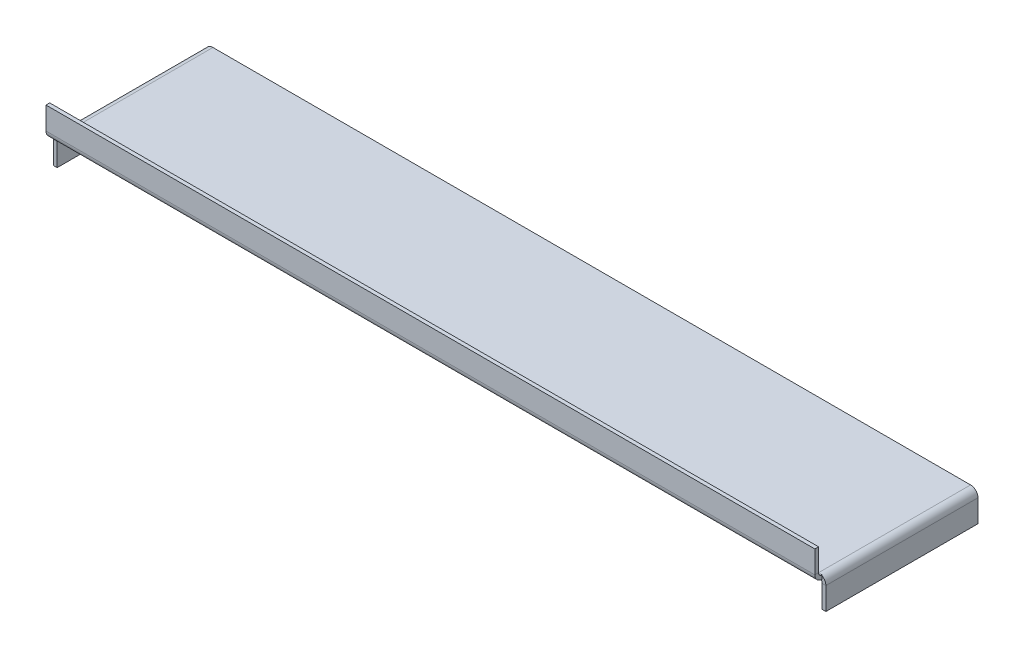
ISO-10303-21;
HEADER;
FILE_DESCRIPTION(('STEP AP214'),'2;1');
FILE_NAME('part.step','',(''),(''),'','','');
FILE_SCHEMA(('AUTOMOTIVE_DESIGN { 1 0 10303 214 1 1 1 1 }'));
ENDSEC;
DATA;
#1=APPLICATION_CONTEXT('core data for automotive mechanical design processes');
#2=APPLICATION_PROTOCOL_DEFINITION('international standard','automotive_design',2000,#1);
#3=PRODUCT_CONTEXT('',#1,'mechanical');
#4=PRODUCT('Part','Part','',(#3));
#5=PRODUCT_RELATED_PRODUCT_CATEGORY('part','',(#4));
#6=PRODUCT_DEFINITION_FORMATION('','',#4);
#7=PRODUCT_DEFINITION_CONTEXT('part definition',#1,'design');
#8=PRODUCT_DEFINITION('design','',#6,#7);
#9=PRODUCT_DEFINITION_SHAPE('','',#8);
#10=(LENGTH_UNIT() NAMED_UNIT(*) SI_UNIT(.MILLI.,.METRE.));
#11=(NAMED_UNIT(*) PLANE_ANGLE_UNIT() SI_UNIT($,.RADIAN.));
#12=(NAMED_UNIT(*) SI_UNIT($,.STERADIAN.) SOLID_ANGLE_UNIT());
#13=UNCERTAINTY_MEASURE_WITH_UNIT(LENGTH_MEASURE(1.E-05),#10,'distance_accuracy_value','');
#14=(GEOMETRIC_REPRESENTATION_CONTEXT(3) GLOBAL_UNCERTAINTY_ASSIGNED_CONTEXT((#13)) GLOBAL_UNIT_ASSIGNED_CONTEXT((#10,
#11,#12)) REPRESENTATION_CONTEXT('',''));
#15=CARTESIAN_POINT('',(0.,0.,0.));
#16=DIRECTION('',(0.,0.,1.));
#17=DIRECTION('',(1.,0.,0.));
#18=AXIS2_PLACEMENT_3D('',#15,#16,#17);
#19=CARTESIAN_POINT('',(244.844000024,-2.3622,46.0777999999999));
#20=DIRECTION('',(0.,0.,-1.));
#21=DIRECTION('',(-1.,0.,0.));
#22=AXIS2_PLACEMENT_3D('',#19,#20,#21);
#23=PLANE('',#22);
#24=DIRECTION('',(0.,-1.,0.));
#25=VECTOR('',#24,1.);
#26=CARTESIAN_POINT('',(244.844000024,0.,46.0778));
#27=LINE('',#26,#25);
#28=CARTESIAN_POINT('',(244.844000024,0.,46.0777999999999));
#29=VERTEX_POINT('',#28);
#30=CARTESIAN_POINT('',(244.844000024,-0.632019950173396,46.0778));
#31=VERTEX_POINT('',#30);
#32=EDGE_CURVE('E388',#29,#31,#27,.T.);
#33=ORIENTED_EDGE('',*,*,#32,.T.);
#34=CARTESIAN_POINT('',(242.484000024,-4.72220000000002,46.0777999999999));
#35=DIRECTION('',(0.,0.,1.));
#36=DIRECTION('',(1.,0.,0.));
#37=AXIS2_PLACEMENT_3D('',#34,#35,#36);
#38=CIRCLE('',#37,4.72219999999997);
#39=CARTESIAN_POINT('',(242.484000024,0.,46.0778));
#40=VERTEX_POINT('',#39);
#41=EDGE_CURVE('E13',#31,#40,#38,.T.);
#42=ORIENTED_EDGE('',*,*,#41,.T.);
#43=DIRECTION('',(1.,0.,0.));
#44=VECTOR('',#43,1.);
#45=CARTESIAN_POINT('',(244.844000024,0.,46.0778));
#46=LINE('',#45,#44);
#47=EDGE_CURVE('E378',#29,#40,#46,.F.);
#48=ORIENTED_EDGE('',*,*,#47,.F.);
#49=EDGE_LOOP('',(#33,#42,#48));
#50=FACE_BOUND('',#49,.T.);
#51=ADVANCED_FACE('F83',(#50),#23,.T.);
#52=CARTESIAN_POINT('',(0.,-2.3622,0.));
#53=DIRECTION('',(0.,1.,0.));
#54=DIRECTION('',(0.,0.,1.));
#55=AXIS2_PLACEMENT_3D('',#52,#53,#54);
#56=PLANE('',#55);
#57=DIRECTION('',(0.,0.,1.));
#58=VECTOR('',#57,1.);
#59=CARTESIAN_POINT('',(242.484000024,-2.36220000000005,46.0777999999999));
#60=LINE('',#59,#58);
#61=CARTESIAN_POINT('',(242.484000024,-2.36220000000005,46.0777999999999));
#62=VERTEX_POINT('',#61);
#63=CARTESIAN_POINT('',(242.484000024,-2.36220000000005,-50.8));
#64=VERTEX_POINT('',#63);
#65=EDGE_CURVE('E273',#62,#64,#60,.F.);
#66=ORIENTED_EDGE('',*,*,#65,.F.);
#67=DIRECTION('',(1.,0.,0.));
#68=VECTOR('',#67,1.);
#69=CARTESIAN_POINT('',(244.844000024,-2.3622,46.0777999999999));
#70=LINE('',#69,#68);
#71=CARTESIAN_POINT('',(-240.121800024,-2.36219999999999,46.0778));
#72=VERTEX_POINT('',#71);
#73=EDGE_CURVE('E370',#62,#72,#70,.F.);
#74=ORIENTED_EDGE('',*,*,#73,.T.);
#75=DIRECTION('',(0.,0.,-1.));
#76=VECTOR('',#75,1.);
#77=CARTESIAN_POINT('',(-240.121800024,-2.36219999999999,-50.8));
#78=LINE('',#77,#76);
#79=CARTESIAN_POINT('',(-240.121800024,-2.36219999999999,-50.8));
#80=VERTEX_POINT('',#79);
#81=EDGE_CURVE('E325',#80,#72,#78,.F.);
#82=ORIENTED_EDGE('',*,*,#81,.F.);
#83=DIRECTION('',(-1.,0.,0.));
#84=VECTOR('',#83,1.);
#85=CARTESIAN_POINT('',(244.844000024,-2.3622,-50.8));
#86=LINE('',#85,#84);
#87=EDGE_CURVE('E92',#64,#80,#86,.T.);
#88=ORIENTED_EDGE('',*,*,#87,.F.);
#89=EDGE_LOOP('',(#66,#74,#82,#88));
#90=FACE_BOUND('',#89,.T.);
#91=ADVANCED_FACE('F441',(#90),#56,.F.);
#92=CARTESIAN_POINT('',(0.,0.,0.));
#93=DIRECTION('',(0.,1.,0.));
#94=DIRECTION('',(0.,0.,1.));
#95=AXIS2_PLACEMENT_3D('',#92,#93,#94);
#96=PLANE('',#95);
#97=CARTESIAN_POINT('',(-240.121800024,0.,46.0778));
#98=VERTEX_POINT('',#97);
#99=EDGE_CURVE('E381',#40,#98,#46,.F.);
#100=ORIENTED_EDGE('',*,*,#99,.F.);
#101=DIRECTION('',(0.,0.,1.));
#102=VECTOR('',#101,1.);
#103=CARTESIAN_POINT('',(242.484000024,0.,46.0777999999999));
#104=LINE('',#103,#102);
#105=CARTESIAN_POINT('',(242.484000024,0.,-50.8));
#106=VERTEX_POINT('',#105);
#107=EDGE_CURVE('E224',#40,#106,#104,.F.);
#108=ORIENTED_EDGE('',*,*,#107,.T.);
#109=DIRECTION('',(-1.,0.,0.));
#110=VECTOR('',#109,1.);
#111=CARTESIAN_POINT('',(244.844000024,0.,-50.8));
#112=LINE('',#111,#110);
#113=CARTESIAN_POINT('',(-240.121800024,0.,-50.8));
#114=VERTEX_POINT('',#113);
#115=EDGE_CURVE('E87',#106,#114,#112,.T.);
#116=ORIENTED_EDGE('',*,*,#115,.T.);
#117=DIRECTION('',(0.,0.,-1.));
#118=VECTOR('',#117,1.);
#119=CARTESIAN_POINT('',(-240.121800024,0.,-50.8));
#120=LINE('',#119,#118);
#121=EDGE_CURVE('E311',#114,#98,#120,.F.);
#122=ORIENTED_EDGE('',*,*,#121,.T.);
#123=EDGE_LOOP('',(#100,#108,#116,#122));
#124=FACE_BOUND('',#123,.T.);
#125=ADVANCED_FACE('F394',(#124),#96,.T.);
#126=CARTESIAN_POINT('',(-240.121800024,-2.36219999999999,46.0778));
#127=DIRECTION('',(0.,0.,-1.));
#128=DIRECTION('',(0.,1.,0.));
#129=AXIS2_PLACEMENT_3D('',#126,#127,#128);
#130=PLANE('',#129);
#131=CARTESIAN_POINT('',(-244.844000024,0.,46.0778));
#132=VERTEX_POINT('',#131);
#133=EDGE_CURVE('E382',#98,#132,#46,.F.);
#134=ORIENTED_EDGE('',*,*,#133,.F.);
#135=CARTESIAN_POINT('',(-240.121800024,-4.72220000000002,46.0778));
#136=DIRECTION('',(0.,0.,-1.));
#137=DIRECTION('',(-1.,0.,0.));
#138=AXIS2_PLACEMENT_3D('',#135,#136,#137);
#139=CIRCLE('',#138,4.72220000000003);
#140=CARTESIAN_POINT('',(-244.211980073827,-2.3622,46.0778));
#141=VERTEX_POINT('',#140);
#142=EDGE_CURVE('E316',#98,#141,#139,.F.);
#143=ORIENTED_EDGE('',*,*,#142,.T.);
#144=DIRECTION('',(-1.,0.,0.));
#145=VECTOR('',#144,1.);
#146=CARTESIAN_POINT('',(-240.121800024,-2.36219999999999,46.0778));
#147=LINE('',#146,#145);
#148=CARTESIAN_POINT('',(-244.844000024,-2.3622,46.0778));
#149=VERTEX_POINT('',#148);
#150=EDGE_CURVE('E332',#141,#149,#147,.T.);
#151=ORIENTED_EDGE('',*,*,#150,.T.);
#152=DIRECTION('',(0.,-1.,0.));
#153=VECTOR('',#152,1.);
#154=CARTESIAN_POINT('',(-244.844000024,0.,46.0778));
#155=LINE('',#154,#153);
#156=EDGE_CURVE('E385',#132,#149,#155,.T.);
#157=ORIENTED_EDGE('',*,*,#156,.F.);
#158=EDGE_LOOP('',(#134,#143,#151,#157));
#159=FACE_BOUND('',#158,.T.);
#160=ADVANCED_FACE('F561',(#159),#130,.T.);
#161=CARTESIAN_POINT('',(244.844000024,-2.3622,-50.8));
#162=DIRECTION('',(0.,0.,-1.));
#163=DIRECTION('',(-1.,0.,0.));
#164=AXIS2_PLACEMENT_3D('',#161,#162,#163);
#165=PLANE('',#164);
#166=DIRECTION('',(0.,1.,0.));
#167=VECTOR('',#166,1.);
#168=CARTESIAN_POINT('',(242.484000024,-2.36220000000005,-50.8));
#169=LINE('',#168,#167);
#170=EDGE_CURVE('E269',#64,#106,#169,.T.);
#171=ORIENTED_EDGE('',*,*,#170,.F.);
#172=ORIENTED_EDGE('',*,*,#87,.T.);
#173=DIRECTION('',(0.,1.,0.));
#174=VECTOR('',#173,1.);
#175=CARTESIAN_POINT('',(-240.121800024,-2.36219999999999,-50.8));
#176=LINE('',#175,#174);
#177=EDGE_CURVE('E319',#80,#114,#176,.T.);
#178=ORIENTED_EDGE('',*,*,#177,.T.);
#179=ORIENTED_EDGE('',*,*,#115,.F.);
#180=EDGE_LOOP('',(#171,#172,#178,#179));
#181=FACE_BOUND('',#180,.T.);
#182=ADVANCED_FACE('F85',(#181),#165,.T.);
#183=CARTESIAN_POINT('',(-244.844000024,2.36,46.0778));
#184=DIRECTION('',(-1.,0.,0.));
#185=DIRECTION('',(0.,0.,1.));
#186=AXIS2_PLACEMENT_3D('',#183,#184,#185);
#187=PLANE('',#186);
#188=DIRECTION('',(0.,0.,-1.));
#189=VECTOR('',#188,1.);
#190=CARTESIAN_POINT('',(-244.844000024,2.35999999999999,50.8));
#191=LINE('',#190,#189);
#192=CARTESIAN_POINT('',(-244.844000024,2.36,48.4378));
#193=VERTEX_POINT('',#192);
#194=CARTESIAN_POINT('',(-244.844000024,2.36,50.8));
#195=VERTEX_POINT('',#194);
#196=EDGE_CURVE('E336',#193,#195,#191,.F.);
#197=ORIENTED_EDGE('',*,*,#196,.F.);
#198=CARTESIAN_POINT('',(-244.844000024,2.36,46.0778));
#199=DIRECTION('',(1.,0.,0.));
#200=DIRECTION('',(0.,0.,-1.));
#201=AXIS2_PLACEMENT_3D('',#198,#199,#200);
#202=CIRCLE('',#201,2.36);
#203=EDGE_CURVE('E375',#132,#193,#202,.F.);
#204=ORIENTED_EDGE('',*,*,#203,.F.);
#205=ORIENTED_EDGE('',*,*,#156,.T.);
#206=CARTESIAN_POINT('',(-244.844000024,2.36,46.0778));
#207=DIRECTION('',(1.,0.,0.));
#208=DIRECTION('',(0.,0.,-1.));
#209=AXIS2_PLACEMENT_3D('',#206,#207,#208);
#210=CIRCLE('',#209,4.7222);
#211=EDGE_CURVE('E369',#149,#195,#210,.F.);
#212=ORIENTED_EDGE('',*,*,#211,.T.);
#213=EDGE_LOOP('',(#197,#204,#205,#212));
#214=FACE_BOUND('',#213,.T.);
#215=ADVANCED_FACE('F654',(#214),#187,.T.);
#216=CARTESIAN_POINT('',(244.844000024,2.36,46.0778));
#217=DIRECTION('',(-1.,0.,0.));
#218=DIRECTION('',(0.,0.,1.));
#219=AXIS2_PLACEMENT_3D('',#216,#217,#218);
#220=PLANE('',#219);
#221=CARTESIAN_POINT('',(244.844000024,2.36,46.0778));
#222=DIRECTION('',(1.,0.,0.));
#223=DIRECTION('',(0.,0.,-1.));
#224=AXIS2_PLACEMENT_3D('',#221,#222,#223);
#225=CIRCLE('',#224,2.36);
#226=CARTESIAN_POINT('',(244.844000024,2.36,48.4378));
#227=VERTEX_POINT('',#226);
#228=EDGE_CURVE('E340',#227,#29,#225,.T.);
#229=ORIENTED_EDGE('',*,*,#228,.F.);
#230=DIRECTION('',(0.,0.,-1.));
#231=VECTOR('',#230,1.);
#232=CARTESIAN_POINT('',(244.844000024,2.36000000000001,48.4378));
#233=LINE('',#232,#231);
#234=CARTESIAN_POINT('',(244.844000024,2.36000000000001,50.8));
#235=VERTEX_POINT('',#234);
#236=EDGE_CURVE('E360',#227,#235,#233,.F.);
#237=ORIENTED_EDGE('',*,*,#236,.T.);
#238=CARTESIAN_POINT('',(244.844000024,2.36,46.0778));
#239=DIRECTION('',(1.,0.,0.));
#240=DIRECTION('',(0.,0.,-1.));
#241=AXIS2_PLACEMENT_3D('',#238,#239,#240);
#242=CIRCLE('',#241,4.7222);
#243=CARTESIAN_POINT('',(244.844000024,-2.3622,46.0777999999999));
#244=VERTEX_POINT('',#243);
#245=EDGE_CURVE('E373',#235,#244,#242,.T.);
#246=ORIENTED_EDGE('',*,*,#245,.T.);
#247=EDGE_CURVE('E101',#31,#244,#27,.T.);
#248=ORIENTED_EDGE('',*,*,#247,.F.);
#249=ORIENTED_EDGE('',*,*,#32,.F.);
#250=EDGE_LOOP('',(#229,#237,#246,#248,#249));
#251=FACE_BOUND('',#250,.T.);
#252=ADVANCED_FACE('F729',(#251),#220,.F.);
#253=CARTESIAN_POINT('',(244.844000024,2.36,46.0778));
#254=DIRECTION('',(1.,0.,0.));
#255=DIRECTION('',(0.,0.,1.));
#256=AXIS2_PLACEMENT_3D('',#253,#254,#255);
#257=CYLINDRICAL_SURFACE('',#256,4.7222);
#258=EDGE_CURVE('E367',#244,#62,#70,.F.);
#259=ORIENTED_EDGE('',*,*,#258,.F.);
#260=ORIENTED_EDGE('',*,*,#245,.F.);
#261=DIRECTION('',(1.,0.,0.));
#262=VECTOR('',#261,1.);
#263=CARTESIAN_POINT('',(-244.844000024,2.35999999999999,50.8));
#264=LINE('',#263,#262);
#265=EDGE_CURVE('E358',#235,#195,#264,.F.);
#266=ORIENTED_EDGE('',*,*,#265,.T.);
#267=ORIENTED_EDGE('',*,*,#211,.F.);
#268=ORIENTED_EDGE('',*,*,#150,.F.);
#269=EDGE_CURVE('E333',#72,#141,#147,.T.);
#270=ORIENTED_EDGE('',*,*,#269,.F.);
#271=ORIENTED_EDGE('',*,*,#73,.F.);
#272=EDGE_LOOP('',(#259,#260,#266,#267,#268,#270,#271));
#273=FACE_BOUND('',#272,.T.);
#274=ADVANCED_FACE('F718',(#273),#257,.T.);
#275=CARTESIAN_POINT('',(244.844000024,2.36,46.0778));
#276=DIRECTION('',(1.,0.,0.));
#277=DIRECTION('',(0.,0.,1.));
#278=AXIS2_PLACEMENT_3D('',#275,#276,#277);
#279=CYLINDRICAL_SURFACE('',#278,2.36);
#280=ORIENTED_EDGE('',*,*,#47,.T.);
#281=ORIENTED_EDGE('',*,*,#99,.T.);
#282=ORIENTED_EDGE('',*,*,#133,.T.);
#283=ORIENTED_EDGE('',*,*,#203,.T.);
#284=DIRECTION('',(1.,0.,0.));
#285=VECTOR('',#284,1.);
#286=CARTESIAN_POINT('',(-244.844000024,2.35999999999999,48.4378));
#287=LINE('',#286,#285);
#288=EDGE_CURVE('E363',#193,#227,#287,.T.);
#289=ORIENTED_EDGE('',*,*,#288,.T.);
#290=ORIENTED_EDGE('',*,*,#228,.T.);
#291=EDGE_LOOP('',(#280,#281,#282,#283,#289,#290));
#292=FACE_BOUND('',#291,.T.);
#293=ADVANCED_FACE('F707',(#292),#279,.F.);
#294=CARTESIAN_POINT('',(244.844000024,16.6878,50.8));
#295=DIRECTION('',(-1.,0.,0.));
#296=DIRECTION('',(0.,-1.,0.));
#297=AXIS2_PLACEMENT_3D('',#294,#295,#296);
#298=PLANE('',#297);
#299=ORIENTED_EDGE('',*,*,#236,.F.);
#300=DIRECTION('',(0.,-1.,0.));
#301=VECTOR('',#300,1.);
#302=CARTESIAN_POINT('',(244.844000024,16.6878,48.4378));
#303=LINE('',#302,#301);
#304=CARTESIAN_POINT('',(244.844000024,16.6878,48.4378));
#305=VERTEX_POINT('',#304);
#306=EDGE_CURVE('E356',#227,#305,#303,.F.);
#307=ORIENTED_EDGE('',*,*,#306,.T.);
#308=DIRECTION('',(0.,0.,-1.));
#309=VECTOR('',#308,1.);
#310=CARTESIAN_POINT('',(244.844000024,16.6878,50.8));
#311=LINE('',#310,#309);
#312=CARTESIAN_POINT('',(244.844000024,16.6878,50.8));
#313=VERTEX_POINT('',#312);
#314=EDGE_CURVE('E337',#313,#305,#311,.T.);
#315=ORIENTED_EDGE('',*,*,#314,.F.);
#316=DIRECTION('',(0.,1.,0.));
#317=VECTOR('',#316,1.);
#318=CARTESIAN_POINT('',(244.844000024,-4.07230800746604E-13,50.8));
#319=LINE('',#318,#317);
#320=EDGE_CURVE('E349',#235,#313,#319,.T.);
#321=ORIENTED_EDGE('',*,*,#320,.F.);
#322=EDGE_LOOP('',(#299,#307,#315,#321));
#323=FACE_BOUND('',#322,.T.);
#324=ADVANCED_FACE('F696',(#323),#298,.F.);
#325=CARTESIAN_POINT('',(-244.844000024,0.,50.8));
#326=DIRECTION('',(1.,0.,0.));
#327=DIRECTION('',(0.,1.,0.));
#328=AXIS2_PLACEMENT_3D('',#325,#326,#327);
#329=PLANE('',#328);
#330=ORIENTED_EDGE('',*,*,#196,.T.);
#331=DIRECTION('',(0.,-1.,0.));
#332=VECTOR('',#331,1.);
#333=CARTESIAN_POINT('',(-244.844000024,4.07230800746604E-13,50.8));
#334=LINE('',#333,#332);
#335=CARTESIAN_POINT('',(-244.844000024,16.6878,50.8));
#336=VERTEX_POINT('',#335);
#337=EDGE_CURVE('E344',#336,#195,#334,.T.);
#338=ORIENTED_EDGE('',*,*,#337,.F.);
#339=DIRECTION('',(0.,0.,-1.));
#340=VECTOR('',#339,1.);
#341=CARTESIAN_POINT('',(-244.844000024,16.6878,50.8));
#342=LINE('',#341,#340);
#343=CARTESIAN_POINT('',(-244.844000024,16.6878,48.4378));
#344=VERTEX_POINT('',#343);
#345=EDGE_CURVE('E341',#336,#344,#342,.T.);
#346=ORIENTED_EDGE('',*,*,#345,.T.);
#347=DIRECTION('',(0.,1.,0.));
#348=VECTOR('',#347,1.);
#349=CARTESIAN_POINT('',(-244.844000024,0.,48.4378));
#350=LINE('',#349,#348);
#351=EDGE_CURVE('E351',#344,#193,#350,.F.);
#352=ORIENTED_EDGE('',*,*,#351,.T.);
#353=EDGE_LOOP('',(#330,#338,#346,#352));
#354=FACE_BOUND('',#353,.T.);
#355=ADVANCED_FACE('F685',(#354),#329,.F.);
#356=CARTESIAN_POINT('',(0.,0.,50.8));
#357=DIRECTION('',(0.,0.,-1.));
#358=DIRECTION('',(-1.,0.,0.));
#359=AXIS2_PLACEMENT_3D('',#356,#357,#358);
#360=PLANE('',#359);
#361=ORIENTED_EDGE('',*,*,#265,.F.);
#362=ORIENTED_EDGE('',*,*,#320,.T.);
#363=DIRECTION('',(-1.,0.,0.));
#364=VECTOR('',#363,1.);
#365=CARTESIAN_POINT('',(0.,16.6878,50.8));
#366=LINE('',#365,#364);
#367=EDGE_CURVE('E347',#313,#336,#366,.T.);
#368=ORIENTED_EDGE('',*,*,#367,.T.);
#369=ORIENTED_EDGE('',*,*,#337,.T.);
#370=EDGE_LOOP('',(#361,#362,#368,#369));
#371=FACE_BOUND('',#370,.T.);
#372=ADVANCED_FACE('F674',(#371),#360,.F.);
#373=CARTESIAN_POINT('',(0.,0.,48.4378));
#374=DIRECTION('',(0.,0.,-1.));
#375=DIRECTION('',(-1.,0.,0.));
#376=AXIS2_PLACEMENT_3D('',#373,#374,#375);
#377=PLANE('',#376);
#378=ORIENTED_EDGE('',*,*,#306,.F.);
#379=ORIENTED_EDGE('',*,*,#288,.F.);
#380=ORIENTED_EDGE('',*,*,#351,.F.);
#381=DIRECTION('',(1.,0.,0.));
#382=VECTOR('',#381,1.);
#383=CARTESIAN_POINT('',(-244.844000024,16.6878,48.4378));
#384=LINE('',#383,#382);
#385=EDGE_CURVE('E354',#305,#344,#384,.F.);
#386=ORIENTED_EDGE('',*,*,#385,.F.);
#387=EDGE_LOOP('',(#378,#379,#380,#386));
#388=FACE_BOUND('',#387,.T.);
#389=ADVANCED_FACE('F663',(#388),#377,.T.);
#390=CARTESIAN_POINT('',(-244.844000024,16.6878,50.8));
#391=DIRECTION('',(0.,-1.,0.));
#392=DIRECTION('',(0.,0.,-1.));
#393=AXIS2_PLACEMENT_3D('',#390,#391,#392);
#394=PLANE('',#393);
#395=ORIENTED_EDGE('',*,*,#385,.T.);
#396=ORIENTED_EDGE('',*,*,#345,.F.);
#397=ORIENTED_EDGE('',*,*,#367,.F.);
#398=ORIENTED_EDGE('',*,*,#314,.T.);
#399=EDGE_LOOP('',(#395,#396,#397,#398));
#400=FACE_BOUND('',#399,.T.);
#401=ADVANCED_FACE('F634',(#400),#394,.F.);
#402=CARTESIAN_POINT('',(-240.121800024,-4.72220000000002,46.0778));
#403=DIRECTION('',(0.,0.,1.));
#404=DIRECTION('',(1.,0.,0.));
#405=AXIS2_PLACEMENT_3D('',#402,#403,#404);
#406=PLANE('',#405);
#407=CARTESIAN_POINT('',(-240.121800024,-4.72220000000002,46.0778));
#408=DIRECTION('',(0.,0.,-1.));
#409=DIRECTION('',(-1.,0.,0.));
#410=AXIS2_PLACEMENT_3D('',#407,#408,#409);
#411=CIRCLE('',#410,2.36000000000003);
#412=CARTESIAN_POINT('',(-242.481800024,-4.72220000000001,46.0778));
#413=VERTEX_POINT('',#412);
#414=EDGE_CURVE('E322',#72,#413,#411,.F.);
#415=ORIENTED_EDGE('',*,*,#414,.F.);
#416=ORIENTED_EDGE('',*,*,#269,.T.);
#417=CARTESIAN_POINT('',(-244.844000024,-4.7222,46.0778));
#418=VERTEX_POINT('',#417);
#419=EDGE_CURVE('E314',#141,#418,#139,.F.);
#420=ORIENTED_EDGE('',*,*,#419,.T.);
#421=DIRECTION('',(1.,0.,0.));
#422=VECTOR('',#421,1.);
#423=CARTESIAN_POINT('',(-244.844000024,-4.7222,46.0778));
#424=LINE('',#423,#422);
#425=EDGE_CURVE('E279',#413,#418,#424,.F.);
#426=ORIENTED_EDGE('',*,*,#425,.F.);
#427=EDGE_LOOP('',(#415,#416,#420,#426));
#428=FACE_BOUND('',#427,.T.);
#429=ADVANCED_FACE('F424',(#428),#406,.T.);
#430=CARTESIAN_POINT('',(-240.121800024,-4.72220000000002,-50.8));
#431=DIRECTION('',(0.,0.,1.));
#432=DIRECTION('',(1.,0.,0.));
#433=AXIS2_PLACEMENT_3D('',#430,#431,#432);
#434=PLANE('',#433);
#435=CARTESIAN_POINT('',(-240.121800024,-4.72220000000002,-50.8));
#436=DIRECTION('',(0.,0.,-1.));
#437=DIRECTION('',(-1.,0.,0.));
#438=AXIS2_PLACEMENT_3D('',#435,#436,#437);
#439=CIRCLE('',#438,2.36000000000003);
#440=CARTESIAN_POINT('',(-242.481800024,-4.72220000000001,-50.8));
#441=VERTEX_POINT('',#440);
#442=EDGE_CURVE('E283',#441,#80,#439,.T.);
#443=ORIENTED_EDGE('',*,*,#442,.F.);
#444=DIRECTION('',(1.,0.,0.));
#445=VECTOR('',#444,1.);
#446=CARTESIAN_POINT('',(-242.481800024,-4.72220000000001,-50.8));
#447=LINE('',#446,#445);
#448=CARTESIAN_POINT('',(-244.844000024,-4.7222,-50.8));
#449=VERTEX_POINT('',#448);
#450=EDGE_CURVE('E304',#441,#449,#447,.F.);
#451=ORIENTED_EDGE('',*,*,#450,.T.);
#452=CARTESIAN_POINT('',(-240.121800024,-4.72220000000002,-50.8));
#453=DIRECTION('',(0.,0.,-1.));
#454=DIRECTION('',(-1.,0.,0.));
#455=AXIS2_PLACEMENT_3D('',#452,#453,#454);
#456=CIRCLE('',#455,4.72220000000003);
#457=EDGE_CURVE('E315',#449,#114,#456,.T.);
#458=ORIENTED_EDGE('',*,*,#457,.T.);
#459=ORIENTED_EDGE('',*,*,#177,.F.);
#460=EDGE_LOOP('',(#443,#451,#458,#459));
#461=FACE_BOUND('',#460,.T.);
#462=ADVANCED_FACE('F403',(#461),#434,.F.);
#463=CARTESIAN_POINT('',(-240.121800024,-4.72220000000002,-50.8));
#464=DIRECTION('',(0.,0.,-1.));
#465=DIRECTION('',(-1.,0.,0.));
#466=AXIS2_PLACEMENT_3D('',#463,#464,#465);
#467=CYLINDRICAL_SURFACE('',#466,4.72220000000003);
#468=ORIENTED_EDGE('',*,*,#121,.F.);
#469=ORIENTED_EDGE('',*,*,#457,.F.);
#470=DIRECTION('',(0.,0.,-1.));
#471=VECTOR('',#470,1.);
#472=CARTESIAN_POINT('',(-244.844000024,-4.7222,46.0778));
#473=LINE('',#472,#471);
#474=EDGE_CURVE('E301',#449,#418,#473,.F.);
#475=ORIENTED_EDGE('',*,*,#474,.T.);
#476=ORIENTED_EDGE('',*,*,#419,.F.);
#477=ORIENTED_EDGE('',*,*,#142,.F.);
#478=EDGE_LOOP('',(#468,#469,#475,#476,#477));
#479=FACE_BOUND('',#478,.T.);
#480=ADVANCED_FACE('F401',(#479),#467,.T.);
#481=CARTESIAN_POINT('',(-240.121800024,-4.72220000000002,-50.8));
#482=DIRECTION('',(0.,0.,-1.));
#483=DIRECTION('',(-1.,0.,0.));
#484=AXIS2_PLACEMENT_3D('',#481,#482,#483);
#485=CYLINDRICAL_SURFACE('',#484,2.36000000000003);
#486=ORIENTED_EDGE('',*,*,#81,.T.);
#487=ORIENTED_EDGE('',*,*,#414,.T.);
#488=DIRECTION('',(0.,0.,-1.));
#489=VECTOR('',#488,1.);
#490=CARTESIAN_POINT('',(-242.481800024,-4.72220000000001,46.0778));
#491=LINE('',#490,#489);
#492=EDGE_CURVE('E307',#413,#441,#491,.T.);
#493=ORIENTED_EDGE('',*,*,#492,.T.);
#494=ORIENTED_EDGE('',*,*,#442,.T.);
#495=EDGE_LOOP('',(#486,#487,#493,#494));
#496=FACE_BOUND('',#495,.T.);
#497=ADVANCED_FACE('F427',(#496),#485,.F.);
#498=CARTESIAN_POINT('',(-244.844000024,-19.05,-50.8));
#499=DIRECTION('',(0.,0.,1.));
#500=DIRECTION('',(0.,-1.,0.));
#501=AXIS2_PLACEMENT_3D('',#498,#499,#500);
#502=PLANE('',#501);
#503=ORIENTED_EDGE('',*,*,#450,.F.);
#504=DIRECTION('',(0.,1.,0.));
#505=VECTOR('',#504,1.);
#506=CARTESIAN_POINT('',(-242.481800024,-19.05,-50.8));
#507=LINE('',#506,#505);
#508=CARTESIAN_POINT('',(-242.481800024,-19.05,-50.8));
#509=VERTEX_POINT('',#508);
#510=EDGE_CURVE('E299',#441,#509,#507,.F.);
#511=ORIENTED_EDGE('',*,*,#510,.T.);
#512=DIRECTION('',(1.,0.,0.));
#513=VECTOR('',#512,1.);
#514=CARTESIAN_POINT('',(-244.844000024,-19.05,-50.8));
#515=LINE('',#514,#513);
#516=CARTESIAN_POINT('',(-244.844000024,-19.05,-50.8));
#517=VERTEX_POINT('',#516);
#518=EDGE_CURVE('E280',#517,#509,#515,.T.);
#519=ORIENTED_EDGE('',*,*,#518,.F.);
#520=DIRECTION('',(0.,-1.,0.));
#521=VECTOR('',#520,1.);
#522=CARTESIAN_POINT('',(-244.844000024,1.2510629441583E-12,-50.8));
#523=LINE('',#522,#521);
#524=EDGE_CURVE('E292',#449,#517,#523,.T.);
#525=ORIENTED_EDGE('',*,*,#524,.F.);
#526=EDGE_LOOP('',(#503,#511,#519,#525));
#527=FACE_BOUND('',#526,.T.);
#528=ADVANCED_FACE('F414',(#527),#502,.F.);
#529=CARTESIAN_POINT('',(-244.844000024,-2.36219999999999,46.0778));
#530=DIRECTION('',(0.,0.,-1.));
#531=DIRECTION('',(-1.,0.,0.));
#532=AXIS2_PLACEMENT_3D('',#529,#530,#531);
#533=PLANE('',#532);
#534=ORIENTED_EDGE('',*,*,#425,.T.);
#535=DIRECTION('',(0.,1.,0.));
#536=VECTOR('',#535,1.);
#537=CARTESIAN_POINT('',(-244.844000024,1.22993997945843E-12,46.0778));
#538=LINE('',#537,#536);
#539=CARTESIAN_POINT('',(-244.844000024,-19.05,46.0778));
#540=VERTEX_POINT('',#539);
#541=EDGE_CURVE('E287',#540,#418,#538,.T.);
#542=ORIENTED_EDGE('',*,*,#541,.F.);
#543=DIRECTION('',(1.,0.,0.));
#544=VECTOR('',#543,1.);
#545=CARTESIAN_POINT('',(-244.844000024,-19.05,46.0778));
#546=LINE('',#545,#544);
#547=CARTESIAN_POINT('',(-242.481800024,-19.05,46.0778));
#548=VERTEX_POINT('',#547);
#549=EDGE_CURVE('E284',#540,#548,#546,.T.);
#550=ORIENTED_EDGE('',*,*,#549,.T.);
#551=DIRECTION('',(0.,-1.,0.));
#552=VECTOR('',#551,1.);
#553=CARTESIAN_POINT('',(-242.481800024,-2.3622,46.0778));
#554=LINE('',#553,#552);
#555=EDGE_CURVE('E294',#548,#413,#554,.F.);
#556=ORIENTED_EDGE('',*,*,#555,.T.);
#557=EDGE_LOOP('',(#534,#542,#550,#556));
#558=FACE_BOUND('',#557,.T.);
#559=ADVANCED_FACE('F421',(#558),#533,.F.);
#560=CARTESIAN_POINT('',(-244.844000024,1.22993997945843E-12,0.));
#561=DIRECTION('',(1.,0.,0.));
#562=DIRECTION('',(0.,1.,0.));
#563=AXIS2_PLACEMENT_3D('',#560,#561,#562);
#564=PLANE('',#563);
#565=ORIENTED_EDGE('',*,*,#474,.F.);
#566=ORIENTED_EDGE('',*,*,#524,.T.);
#567=DIRECTION('',(0.,0.,1.));
#568=VECTOR('',#567,1.);
#569=CARTESIAN_POINT('',(-244.844000024,-19.05,0.));
#570=LINE('',#569,#568);
#571=EDGE_CURVE('E290',#517,#540,#570,.T.);
#572=ORIENTED_EDGE('',*,*,#571,.T.);
#573=ORIENTED_EDGE('',*,*,#541,.T.);
#574=EDGE_LOOP('',(#565,#566,#572,#573));
#575=FACE_BOUND('',#574,.T.);
#576=ADVANCED_FACE('F410',(#575),#564,.F.);
#577=CARTESIAN_POINT('',(-242.481800024,1.22169240223981E-12,0.));
#578=DIRECTION('',(1.,0.,0.));
#579=DIRECTION('',(0.,1.,0.));
#580=AXIS2_PLACEMENT_3D('',#577,#578,#579);
#581=PLANE('',#580);
#582=ORIENTED_EDGE('',*,*,#510,.F.);
#583=ORIENTED_EDGE('',*,*,#492,.F.);
#584=ORIENTED_EDGE('',*,*,#555,.F.);
#585=DIRECTION('',(0.,0.,-1.));
#586=VECTOR('',#585,1.);
#587=CARTESIAN_POINT('',(-242.481800024,-19.05,46.0778));
#588=LINE('',#587,#586);
#589=EDGE_CURVE('E297',#509,#548,#588,.F.);
#590=ORIENTED_EDGE('',*,*,#589,.F.);
#591=EDGE_LOOP('',(#582,#583,#584,#590));
#592=FACE_BOUND('',#591,.T.);
#593=ADVANCED_FACE('F429',(#592),#581,.T.);
#594=CARTESIAN_POINT('',(-244.844000024,-19.05,46.0778));
#595=DIRECTION('',(0.,1.,0.));
#596=DIRECTION('',(-1.,0.,0.));
#597=AXIS2_PLACEMENT_3D('',#594,#595,#596);
#598=PLANE('',#597);
#599=ORIENTED_EDGE('',*,*,#589,.T.);
#600=ORIENTED_EDGE('',*,*,#549,.F.);
#601=ORIENTED_EDGE('',*,*,#571,.F.);
#602=ORIENTED_EDGE('',*,*,#518,.T.);
#603=EDGE_LOOP('',(#599,#600,#601,#602));
#604=FACE_BOUND('',#603,.T.);
#605=ADVANCED_FACE('F417',(#604),#598,.F.);
#606=CARTESIAN_POINT('',(242.484000024,-4.72220000000002,-50.8));
#607=DIRECTION('',(0.,0.,-1.));
#608=DIRECTION('',(-1.,0.,0.));
#609=AXIS2_PLACEMENT_3D('',#606,#607,#608);
#610=PLANE('',#609);
#611=DIRECTION('',(1.,0.,0.));
#612=VECTOR('',#611,1.);
#613=CARTESIAN_POINT('',(244.844000024,-4.72220000000001,-50.8));
#614=LINE('',#613,#612);
#615=CARTESIAN_POINT('',(244.844000024,-4.72220000000001,-50.8));
#616=VERTEX_POINT('',#615);
#617=CARTESIAN_POINT('',(247.206200024,-4.7222,-50.8));
#618=VERTEX_POINT('',#617);
#619=EDGE_CURVE('E788',#616,#618,#614,.T.);
#620=ORIENTED_EDGE('',*,*,#619,.F.);
#621=CARTESIAN_POINT('',(242.484000024,-4.72220000000002,-50.8));
#622=DIRECTION('',(0.,0.,1.));
#623=DIRECTION('',(1.,0.,0.));
#624=AXIS2_PLACEMENT_3D('',#621,#622,#623);
#625=CIRCLE('',#624,2.35999999999997);
#626=EDGE_CURVE('E225',#64,#616,#625,.F.);
#627=ORIENTED_EDGE('',*,*,#626,.F.);
#628=ORIENTED_EDGE('',*,*,#170,.T.);
#629=CARTESIAN_POINT('',(242.484000024,-4.72220000000002,-50.8));
#630=DIRECTION('',(0.,0.,1.));
#631=DIRECTION('',(1.,0.,0.));
#632=AXIS2_PLACEMENT_3D('',#629,#630,#631);
#633=CIRCLE('',#632,4.72219999999997);
#634=EDGE_CURVE('E268',#106,#618,#633,.F.);
#635=ORIENTED_EDGE('',*,*,#634,.T.);
#636=EDGE_LOOP('',(#620,#627,#628,#635));
#637=FACE_BOUND('',#636,.T.);
#638=ADVANCED_FACE('F436',(#637),#610,.T.);
#639=CARTESIAN_POINT('',(242.484000024,-4.72220000000002,46.0777999999999));
#640=DIRECTION('',(0.,0.,-1.));
#641=DIRECTION('',(-1.,0.,0.));
#642=AXIS2_PLACEMENT_3D('',#639,#640,#641);
#643=PLANE('',#642);
#644=CARTESIAN_POINT('',(247.206200024,-4.7222,46.0777999999999));
#645=VERTEX_POINT('',#644);
#646=EDGE_CURVE('E94',#645,#31,#38,.T.);
#647=ORIENTED_EDGE('',*,*,#646,.T.);
#648=ORIENTED_EDGE('',*,*,#247,.T.);
#649=ORIENTED_EDGE('',*,*,#258,.T.);
#650=CARTESIAN_POINT('',(242.484000024,-4.72220000000002,46.0777999999999));
#651=DIRECTION('',(0.,0.,1.));
#652=DIRECTION('',(1.,0.,0.));
#653=AXIS2_PLACEMENT_3D('',#650,#651,#652);
#654=CIRCLE('',#653,2.35999999999997);
#655=CARTESIAN_POINT('',(244.844000024,-4.72220000000001,46.0777999999999));
#656=VERTEX_POINT('',#655);
#657=EDGE_CURVE('E232',#656,#62,#654,.T.);
#658=ORIENTED_EDGE('',*,*,#657,.F.);
#659=DIRECTION('',(1.,0.,0.));
#660=VECTOR('',#659,1.);
#661=CARTESIAN_POINT('',(244.844000024,-4.72220000000001,46.0777999999999));
#662=LINE('',#661,#660);
#663=EDGE_CURVE('E228',#656,#645,#662,.T.);
#664=ORIENTED_EDGE('',*,*,#663,.T.);
#665=EDGE_LOOP('',(#647,#648,#649,#658,#664));
#666=FACE_BOUND('',#665,.T.);
#667=ADVANCED_FACE('F229',(#666),#643,.F.);
#668=CARTESIAN_POINT('',(242.484000024,-4.72220000000002,46.0777999999999));
#669=DIRECTION('',(0.,0.,1.));
#670=DIRECTION('',(1.,0.,0.));
#671=AXIS2_PLACEMENT_3D('',#668,#669,#670);
#672=CYLINDRICAL_SURFACE('',#671,4.72219999999997);
#673=ORIENTED_EDGE('',*,*,#107,.F.);
#674=ORIENTED_EDGE('',*,*,#41,.F.);
#675=ORIENTED_EDGE('',*,*,#646,.F.);
#676=DIRECTION('',(0.,0.,-1.));
#677=VECTOR('',#676,1.);
#678=CARTESIAN_POINT('',(247.206200024,-4.7222,0.));
#679=LINE('',#678,#677);
#680=EDGE_CURVE('E221',#645,#618,#679,.T.);
#681=ORIENTED_EDGE('',*,*,#680,.T.);
#682=ORIENTED_EDGE('',*,*,#634,.F.);
#683=EDGE_LOOP('',(#673,#674,#675,#681,#682));
#684=FACE_BOUND('',#683,.T.);
#685=ADVANCED_FACE('F218',(#684),#672,.T.);
#686=CARTESIAN_POINT('',(242.484000024,-4.72220000000002,46.0777999999999));
#687=DIRECTION('',(0.,0.,1.));
#688=DIRECTION('',(1.,0.,0.));
#689=AXIS2_PLACEMENT_3D('',#686,#687,#688);
#690=CYLINDRICAL_SURFACE('',#689,2.35999999999997);
#691=ORIENTED_EDGE('',*,*,#65,.T.);
#692=ORIENTED_EDGE('',*,*,#626,.T.);
#693=DIRECTION('',(0.,0.,1.));
#694=VECTOR('',#693,1.);
#695=CARTESIAN_POINT('',(244.844000024,-4.72220000000001,-50.8));
#696=LINE('',#695,#694);
#697=EDGE_CURVE('E236',#616,#656,#696,.T.);
#698=ORIENTED_EDGE('',*,*,#697,.T.);
#699=ORIENTED_EDGE('',*,*,#657,.T.);
#700=EDGE_LOOP('',(#691,#692,#698,#699));
#701=FACE_BOUND('',#700,.T.);
#702=ADVANCED_FACE('F454',(#701),#690,.F.);
#703=CARTESIAN_POINT('',(247.206200024,-19.05,46.0777999999999));
#704=DIRECTION('',(0.,0.,-1.));
#705=DIRECTION('',(0.,1.,0.));
#706=AXIS2_PLACEMENT_3D('',#703,#704,#705);
#707=PLANE('',#706);
#708=ORIENTED_EDGE('',*,*,#663,.F.);
#709=DIRECTION('',(0.,-1.,0.));
#710=VECTOR('',#709,1.);
#711=CARTESIAN_POINT('',(244.844000024,-19.05,46.0777999999999));
#712=LINE('',#711,#710);
#713=CARTESIAN_POINT('',(244.844000024,-19.05,46.0777999999999));
#714=VERTEX_POINT('',#713);
#715=EDGE_CURVE('E245',#656,#714,#712,.T.);
#716=ORIENTED_EDGE('',*,*,#715,.T.);
#717=DIRECTION('',(-1.,0.,0.));
#718=VECTOR('',#717,1.);
#719=CARTESIAN_POINT('',(247.206200024,-19.05,46.0777999999999));
#720=LINE('',#719,#718);
#721=CARTESIAN_POINT('',(247.206200024,-19.05,46.0777999999999));
#722=VERTEX_POINT('',#721);
#723=EDGE_CURVE('E249',#722,#714,#720,.T.);
#724=ORIENTED_EDGE('',*,*,#723,.F.);
#725=DIRECTION('',(0.,-1.,0.));
#726=VECTOR('',#725,1.);
#727=CARTESIAN_POINT('',(247.206200024,-19.05,46.0777999999999));
#728=LINE('',#727,#726);
#729=EDGE_CURVE('E241',#645,#722,#728,.T.);
#730=ORIENTED_EDGE('',*,*,#729,.F.);
#731=EDGE_LOOP('',(#708,#716,#724,#730));
#732=FACE_BOUND('',#731,.T.);
#733=ADVANCED_FACE('F247',(#732),#707,.F.);
#734=CARTESIAN_POINT('',(247.206200024,-2.36219999999999,-50.8));
#735=DIRECTION('',(0.,0.,1.));
#736=DIRECTION('',(1.,0.,0.));
#737=AXIS2_PLACEMENT_3D('',#734,#735,#736);
#738=PLANE('',#737);
#739=ORIENTED_EDGE('',*,*,#619,.T.);
#740=DIRECTION('',(0.,1.,0.));
#741=VECTOR('',#740,1.);
#742=CARTESIAN_POINT('',(247.206200024,-2.36219999999999,-50.8));
#743=LINE('',#742,#741);
#744=CARTESIAN_POINT('',(247.206200024,-19.05,-50.8));
#745=VERTEX_POINT('',#744);
#746=EDGE_CURVE('E244',#745,#618,#743,.T.);
#747=ORIENTED_EDGE('',*,*,#746,.F.);
#748=DIRECTION('',(-1.,0.,0.));
#749=VECTOR('',#748,1.);
#750=CARTESIAN_POINT('',(247.206200024,-19.05,-50.8));
#751=LINE('',#750,#749);
#752=CARTESIAN_POINT('',(244.844000024,-19.05,-50.8));
#753=VERTEX_POINT('',#752);
#754=EDGE_CURVE('E261',#745,#753,#751,.T.);
#755=ORIENTED_EDGE('',*,*,#754,.T.);
#756=DIRECTION('',(0.,1.,0.));
#757=VECTOR('',#756,1.);
#758=CARTESIAN_POINT('',(244.844000024,-2.3622,-50.8));
#759=LINE('',#758,#757);
#760=EDGE_CURVE('E252',#753,#616,#759,.T.);
#761=ORIENTED_EDGE('',*,*,#760,.T.);
#762=EDGE_LOOP('',(#739,#747,#755,#761));
#763=FACE_BOUND('',#762,.T.);
#764=ADVANCED_FACE('F462',(#763),#738,.F.);
#765=CARTESIAN_POINT('',(247.206200024,1.22993997945843E-12,0.));
#766=DIRECTION('',(-1.,0.,0.));
#767=DIRECTION('',(0.,-1.,0.));
#768=AXIS2_PLACEMENT_3D('',#765,#766,#767);
#769=PLANE('',#768);
#770=ORIENTED_EDGE('',*,*,#680,.F.);
#771=ORIENTED_EDGE('',*,*,#729,.T.);
#772=DIRECTION('',(0.,0.,-1.));
#773=VECTOR('',#772,1.);
#774=CARTESIAN_POINT('',(247.206200024,-19.05,-50.8));
#775=LINE('',#774,#773);
#776=EDGE_CURVE('E251',#722,#745,#775,.T.);
#777=ORIENTED_EDGE('',*,*,#776,.T.);
#778=ORIENTED_EDGE('',*,*,#746,.T.);
#779=EDGE_LOOP('',(#770,#771,#777,#778));
#780=FACE_BOUND('',#779,.T.);
#781=ADVANCED_FACE('F240',(#780),#769,.F.);
#782=CARTESIAN_POINT('',(244.844000024,1.22169240223981E-12,0.));
#783=DIRECTION('',(-1.,0.,0.));
#784=DIRECTION('',(0.,-1.,0.));
#785=AXIS2_PLACEMENT_3D('',#782,#783,#784);
#786=PLANE('',#785);
#787=ORIENTED_EDGE('',*,*,#715,.F.);
#788=ORIENTED_EDGE('',*,*,#697,.F.);
#789=ORIENTED_EDGE('',*,*,#760,.F.);
#790=DIRECTION('',(0.,0.,-1.));
#791=VECTOR('',#790,1.);
#792=CARTESIAN_POINT('',(244.844000024,-19.05,-50.8));
#793=LINE('',#792,#791);
#794=EDGE_CURVE('E256',#714,#753,#793,.T.);
#795=ORIENTED_EDGE('',*,*,#794,.F.);
#796=EDGE_LOOP('',(#787,#788,#789,#795));
#797=FACE_BOUND('',#796,.T.);
#798=ADVANCED_FACE('F466',(#797),#786,.T.);
#799=CARTESIAN_POINT('',(247.206200024,-19.05,-50.8));
#800=DIRECTION('',(0.,1.,0.));
#801=DIRECTION('',(-1.,0.,0.));
#802=AXIS2_PLACEMENT_3D('',#799,#800,#801);
#803=PLANE('',#802);
#804=ORIENTED_EDGE('',*,*,#794,.T.);
#805=ORIENTED_EDGE('',*,*,#754,.F.);
#806=ORIENTED_EDGE('',*,*,#776,.F.);
#807=ORIENTED_EDGE('',*,*,#723,.T.);
#808=EDGE_LOOP('',(#804,#805,#806,#807));
#809=FACE_BOUND('',#808,.T.);
#810=ADVANCED_FACE('F463',(#809),#803,.F.);
#811=CLOSED_SHELL('',(#51,#91,#125,#160,#182,#215,#252,#274,#293,#324,#355,#372,#389,#401,#429,
#462,#480,#497,#528,#559,#576,#593,#605,#638,#667,#685,#702,#733,#764,#781,#798,#810));
#812=MANIFOLD_SOLID_BREP('B2',#811);
#813=ADVANCED_BREP_SHAPE_REPRESENTATION('',(#18,#812),#14);
#814=SHAPE_DEFINITION_REPRESENTATION(#9,#813);
ENDSEC;
END-ISO-10303-21;
